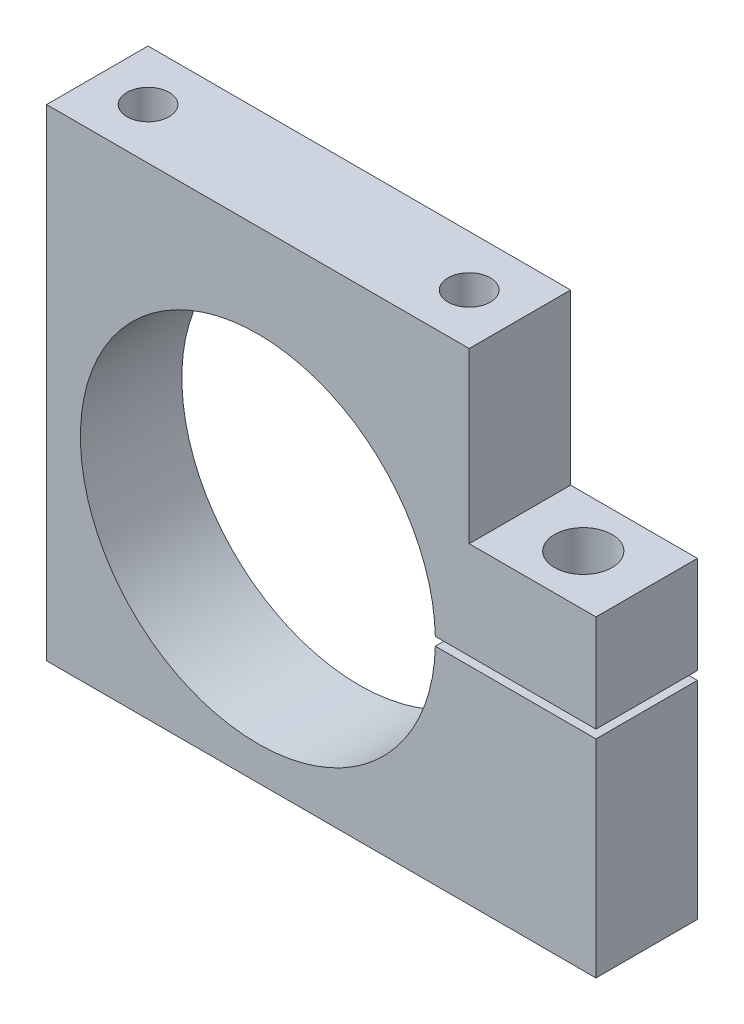
ISO-10303-21;
HEADER;
FILE_DESCRIPTION(('STEP AP214'),'2;1');
FILE_NAME('part.step','',(''),(''),'','','');
FILE_SCHEMA(('AUTOMOTIVE_DESIGN { 1 0 10303 214 1 1 1 1 }'));
ENDSEC;
DATA;
#1=APPLICATION_CONTEXT('core data for automotive mechanical design processes');
#2=APPLICATION_PROTOCOL_DEFINITION('international standard','automotive_design',2000,#1);
#3=PRODUCT_CONTEXT('',#1,'mechanical');
#4=PRODUCT('Part','Part','',(#3));
#5=PRODUCT_RELATED_PRODUCT_CATEGORY('part','',(#4));
#6=PRODUCT_DEFINITION_FORMATION('','',#4);
#7=PRODUCT_DEFINITION_CONTEXT('part definition',#1,'design');
#8=PRODUCT_DEFINITION('design','',#6,#7);
#9=PRODUCT_DEFINITION_SHAPE('','',#8);
#10=(LENGTH_UNIT() NAMED_UNIT(*) SI_UNIT(.MILLI.,.METRE.));
#11=(NAMED_UNIT(*) PLANE_ANGLE_UNIT() SI_UNIT($,.RADIAN.));
#12=(NAMED_UNIT(*) SI_UNIT($,.STERADIAN.) SOLID_ANGLE_UNIT());
#13=UNCERTAINTY_MEASURE_WITH_UNIT(LENGTH_MEASURE(1.E-05),#10,'distance_accuracy_value','');
#14=(GEOMETRIC_REPRESENTATION_CONTEXT(3) GLOBAL_UNCERTAINTY_ASSIGNED_CONTEXT((#13)) GLOBAL_UNIT_ASSIGNED_CONTEXT((#10,
#11,#12)) REPRESENTATION_CONTEXT('',''));
#15=CARTESIAN_POINT('',(0.,0.,0.));
#16=DIRECTION('',(0.,0.,1.));
#17=DIRECTION('',(1.,0.,0.));
#18=AXIS2_PLACEMENT_3D('',#15,#16,#17);
#19=CARTESIAN_POINT('',(65.,37.,12.));
#20=DIRECTION('',(-1.,0.,0.));
#21=DIRECTION('',(0.,0.,1.));
#22=AXIS2_PLACEMENT_3D('',#19,#20,#21);
#23=PLANE('',#22);
#24=DIRECTION('',(0.,1.,0.));
#25=VECTOR('',#24,1.);
#26=CARTESIAN_POINT('',(65.,37.,12.));
#27=LINE('',#26,#25);
#28=CARTESIAN_POINT('',(65.,25.5,12.));
#29=VERTEX_POINT('',#28);
#30=CARTESIAN_POINT('',(65.,37.,12.));
#31=VERTEX_POINT('',#30);
#32=EDGE_CURVE('E195',#29,#31,#27,.T.);
#33=ORIENTED_EDGE('',*,*,#32,.F.);
#34=DIRECTION('',(0.,0.,1.));
#35=VECTOR('',#34,1.);
#36=CARTESIAN_POINT('',(65.,25.5,0.));
#37=LINE('',#36,#35);
#38=CARTESIAN_POINT('',(65.,25.5,0.));
#39=VERTEX_POINT('',#38);
#40=EDGE_CURVE('E181',#39,#29,#37,.T.);
#41=ORIENTED_EDGE('',*,*,#40,.F.);
#42=DIRECTION('',(0.,1.,0.));
#43=VECTOR('',#42,1.);
#44=CARTESIAN_POINT('',(65.,37.,0.));
#45=LINE('',#44,#43);
#46=CARTESIAN_POINT('',(65.,37.,0.));
#47=VERTEX_POINT('',#46);
#48=EDGE_CURVE('E211',#39,#47,#45,.T.);
#49=ORIENTED_EDGE('',*,*,#48,.T.);
#50=DIRECTION('',(0.,0.,-1.));
#51=VECTOR('',#50,1.);
#52=CARTESIAN_POINT('',(65.,37.,12.));
#53=LINE('',#52,#51);
#54=EDGE_CURVE('E233',#31,#47,#53,.T.);
#55=ORIENTED_EDGE('',*,*,#54,.F.);
#56=EDGE_LOOP('',(#33,#41,#49,#55));
#57=FACE_BOUND('',#56,.T.);
#58=ADVANCED_FACE('F41',(#57),#23,.F.);
#59=CARTESIAN_POINT('',(0.,0.,12.));
#60=DIRECTION('',(0.,0.,-1.));
#61=DIRECTION('',(-1.,0.,0.));
#62=AXIS2_PLACEMENT_3D('',#59,#60,#61);
#63=PLANE('',#62);
#64=CARTESIAN_POINT('',(25.,25.,12.));
#65=DIRECTION('',(0.,0.,1.));
#66=DIRECTION('',(1.,0.,0.));
#67=AXIS2_PLACEMENT_3D('',#64,#65,#66);
#68=CIRCLE('',#67,21.);
#69=CARTESIAN_POINT('',(45.994046775217,25.5,12.));
#70=VERTEX_POINT('',#69);
#71=CARTESIAN_POINT('',(45.994046775217,24.5,12.));
#72=VERTEX_POINT('',#71);
#73=EDGE_CURVE('E186',#70,#72,#68,.T.);
#74=ORIENTED_EDGE('',*,*,#73,.F.);
#75=DIRECTION('',(-1.,0.,0.));
#76=VECTOR('',#75,1.);
#77=CARTESIAN_POINT('',(45.,25.5,12.));
#78=LINE('',#77,#76);
#79=EDGE_CURVE('E64',#29,#70,#78,.T.);
#80=ORIENTED_EDGE('',*,*,#79,.F.);
#81=ORIENTED_EDGE('',*,*,#32,.T.);
#82=DIRECTION('',(-1.,0.,0.));
#83=VECTOR('',#82,1.);
#84=CARTESIAN_POINT('',(50.,37.,12.));
#85=LINE('',#84,#83);
#86=CARTESIAN_POINT('',(50.,37.,12.));
#87=VERTEX_POINT('',#86);
#88=EDGE_CURVE('E200',#31,#87,#85,.T.);
#89=ORIENTED_EDGE('',*,*,#88,.T.);
#90=DIRECTION('',(0.,1.,0.));
#91=VECTOR('',#90,1.);
#92=CARTESIAN_POINT('',(50.,57.,12.));
#93=LINE('',#92,#91);
#94=CARTESIAN_POINT('',(50.,57.,12.));
#95=VERTEX_POINT('',#94);
#96=EDGE_CURVE('E202',#87,#95,#93,.T.);
#97=ORIENTED_EDGE('',*,*,#96,.T.);
#98=DIRECTION('',(-1.,0.,0.));
#99=VECTOR('',#98,1.);
#100=CARTESIAN_POINT('',(0.,57.,12.));
#101=LINE('',#100,#99);
#102=CARTESIAN_POINT('',(0.,57.,12.));
#103=VERTEX_POINT('',#102);
#104=EDGE_CURVE('E204',#95,#103,#101,.T.);
#105=ORIENTED_EDGE('',*,*,#104,.T.);
#106=DIRECTION('',(0.,-1.,0.));
#107=VECTOR('',#106,1.);
#108=CARTESIAN_POINT('',(0.,0.,12.));
#109=LINE('',#108,#107);
#110=CARTESIAN_POINT('',(0.,0.,12.));
#111=VERTEX_POINT('',#110);
#112=EDGE_CURVE('E206',#103,#111,#109,.T.);
#113=ORIENTED_EDGE('',*,*,#112,.T.);
#114=DIRECTION('',(1.,0.,0.));
#115=VECTOR('',#114,1.);
#116=CARTESIAN_POINT('',(0.,0.,12.));
#117=LINE('',#116,#115);
#118=CARTESIAN_POINT('',(65.,0.,12.));
#119=VERTEX_POINT('',#118);
#120=EDGE_CURVE('E192',#111,#119,#117,.T.);
#121=ORIENTED_EDGE('',*,*,#120,.T.);
#122=CARTESIAN_POINT('',(65.,24.5,12.));
#123=VERTEX_POINT('',#122);
#124=EDGE_CURVE('E197',#119,#123,#27,.T.);
#125=ORIENTED_EDGE('',*,*,#124,.T.);
#126=DIRECTION('',(1.,0.,0.));
#127=VECTOR('',#126,1.);
#128=CARTESIAN_POINT('',(65.,24.5,12.));
#129=LINE('',#128,#127);
#130=EDGE_CURVE('E173',#72,#123,#129,.T.);
#131=ORIENTED_EDGE('',*,*,#130,.F.);
#132=EDGE_LOOP('',(#74,#80,#81,#89,#97,#105,#113,#121,#125,#131));
#133=FACE_BOUND('',#132,.T.);
#134=ADVANCED_FACE('F245',(#133),#63,.F.);
#135=CARTESIAN_POINT('',(0.,0.,0.));
#136=DIRECTION('',(0.,0.,-1.));
#137=DIRECTION('',(-1.,0.,0.));
#138=AXIS2_PLACEMENT_3D('',#135,#136,#137);
#139=PLANE('',#138);
#140=DIRECTION('',(-1.,0.,0.));
#141=VECTOR('',#140,1.);
#142=CARTESIAN_POINT('',(45.,25.5,0.));
#143=LINE('',#142,#141);
#144=CARTESIAN_POINT('',(45.994046775217,25.5,0.));
#145=VERTEX_POINT('',#144);
#146=EDGE_CURVE('E175',#39,#145,#143,.T.);
#147=ORIENTED_EDGE('',*,*,#146,.T.);
#148=CARTESIAN_POINT('',(25.,25.,0.));
#149=DIRECTION('',(0.,0.,1.));
#150=DIRECTION('',(1.,0.,0.));
#151=AXIS2_PLACEMENT_3D('',#148,#149,#150);
#152=CIRCLE('',#151,21.);
#153=CARTESIAN_POINT('',(45.994046775217,24.5,0.));
#154=VERTEX_POINT('',#153);
#155=EDGE_CURVE('E183',#145,#154,#152,.T.);
#156=ORIENTED_EDGE('',*,*,#155,.T.);
#157=DIRECTION('',(1.,0.,0.));
#158=VECTOR('',#157,1.);
#159=CARTESIAN_POINT('',(65.,24.5,0.));
#160=LINE('',#159,#158);
#161=CARTESIAN_POINT('',(65.,24.5,0.));
#162=VERTEX_POINT('',#161);
#163=EDGE_CURVE('E57',#154,#162,#160,.T.);
#164=ORIENTED_EDGE('',*,*,#163,.T.);
#165=CARTESIAN_POINT('',(65.,0.,0.));
#166=VERTEX_POINT('',#165);
#167=EDGE_CURVE('E212',#166,#162,#45,.T.);
#168=ORIENTED_EDGE('',*,*,#167,.F.);
#169=DIRECTION('',(1.,0.,0.));
#170=VECTOR('',#169,1.);
#171=CARTESIAN_POINT('',(0.,0.,0.));
#172=LINE('',#171,#170);
#173=CARTESIAN_POINT('',(0.,0.,0.));
#174=VERTEX_POINT('',#173);
#175=EDGE_CURVE('E189',#174,#166,#172,.T.);
#176=ORIENTED_EDGE('',*,*,#175,.F.);
#177=DIRECTION('',(0.,-1.,0.));
#178=VECTOR('',#177,1.);
#179=CARTESIAN_POINT('',(0.,0.,0.));
#180=LINE('',#179,#178);
#181=CARTESIAN_POINT('',(0.,57.,0.));
#182=VERTEX_POINT('',#181);
#183=EDGE_CURVE('E196',#182,#174,#180,.T.);
#184=ORIENTED_EDGE('',*,*,#183,.F.);
#185=DIRECTION('',(-1.,0.,0.));
#186=VECTOR('',#185,1.);
#187=CARTESIAN_POINT('',(0.,57.,0.));
#188=LINE('',#187,#186);
#189=CARTESIAN_POINT('',(50.,57.,0.));
#190=VERTEX_POINT('',#189);
#191=EDGE_CURVE('E219',#190,#182,#188,.T.);
#192=ORIENTED_EDGE('',*,*,#191,.F.);
#193=DIRECTION('',(0.,1.,0.));
#194=VECTOR('',#193,1.);
#195=CARTESIAN_POINT('',(50.,57.,0.));
#196=LINE('',#195,#194);
#197=CARTESIAN_POINT('',(50.,37.,0.));
#198=VERTEX_POINT('',#197);
#199=EDGE_CURVE('E217',#198,#190,#196,.T.);
#200=ORIENTED_EDGE('',*,*,#199,.F.);
#201=DIRECTION('',(-1.,0.,0.));
#202=VECTOR('',#201,1.);
#203=CARTESIAN_POINT('',(50.,37.,0.));
#204=LINE('',#203,#202);
#205=EDGE_CURVE('E215',#47,#198,#204,.T.);
#206=ORIENTED_EDGE('',*,*,#205,.F.);
#207=ORIENTED_EDGE('',*,*,#48,.F.);
#208=EDGE_LOOP('',(#147,#156,#164,#168,#176,#184,#192,#200,#206,#207));
#209=FACE_BOUND('',#208,.T.);
#210=ADVANCED_FACE('F251',(#209),#139,.T.);
#211=CARTESIAN_POINT('',(0.,0.,12.));
#212=DIRECTION('',(0.,1.,0.));
#213=DIRECTION('',(0.,0.,1.));
#214=AXIS2_PLACEMENT_3D('',#211,#212,#213);
#215=PLANE('',#214);
#216=CARTESIAN_POINT('',(4.,0.,6.));
#217=DIRECTION('',(0.,-1.,0.));
#218=DIRECTION('',(0.,0.,-1.));
#219=AXIS2_PLACEMENT_3D('',#216,#217,#218);
#220=CIRCLE('',#219,2.49999999999999);
#221=CARTESIAN_POINT('',(4.,0.,3.50000000000001));
#222=VERTEX_POINT('',#221);
#223=EDGE_CURVE('E142',#222,#222,#220,.T.);
#224=ORIENTED_EDGE('',*,*,#223,.F.);
#225=EDGE_LOOP('',(#224));
#226=FACE_BOUND('',#225,.T.);
#227=CARTESIAN_POINT('',(48.,0.,6.));
#228=DIRECTION('',(0.,-1.,0.));
#229=DIRECTION('',(0.,0.,-1.));
#230=AXIS2_PLACEMENT_3D('',#227,#228,#229);
#231=CIRCLE('',#230,2.49999999999999);
#232=CARTESIAN_POINT('',(48.,0.,3.50000000000001));
#233=VERTEX_POINT('',#232);
#234=EDGE_CURVE('E141',#233,#233,#231,.T.);
#235=ORIENTED_EDGE('',*,*,#234,.F.);
#236=EDGE_LOOP('',(#235));
#237=FACE_BOUND('',#236,.T.);
#238=ORIENTED_EDGE('',*,*,#175,.T.);
#239=DIRECTION('',(0.,0.,-1.));
#240=VECTOR('',#239,1.);
#241=CARTESIAN_POINT('',(65.,0.,12.));
#242=LINE('',#241,#240);
#243=EDGE_CURVE('E236',#119,#166,#242,.T.);
#244=ORIENTED_EDGE('',*,*,#243,.F.);
#245=ORIENTED_EDGE('',*,*,#120,.F.);
#246=DIRECTION('',(0.,0.,-1.));
#247=VECTOR('',#246,1.);
#248=CARTESIAN_POINT('',(0.,0.,12.));
#249=LINE('',#248,#247);
#250=EDGE_CURVE('E208',#111,#174,#249,.T.);
#251=ORIENTED_EDGE('',*,*,#250,.T.);
#252=EDGE_LOOP('',(#238,#244,#245,#251));
#253=FACE_BOUND('',#252,.T.);
#254=ADVANCED_FACE('F43',(#226,#237,#253),#215,.F.);
#255=ORIENTED_EDGE('',*,*,#167,.T.);
#256=DIRECTION('',(0.,0.,1.));
#257=VECTOR('',#256,1.);
#258=CARTESIAN_POINT('',(65.,24.5,0.));
#259=LINE('',#258,#257);
#260=EDGE_CURVE('E178',#162,#123,#259,.T.);
#261=ORIENTED_EDGE('',*,*,#260,.T.);
#262=ORIENTED_EDGE('',*,*,#124,.F.);
#263=ORIENTED_EDGE('',*,*,#243,.T.);
#264=EDGE_LOOP('',(#255,#261,#262,#263));
#265=FACE_BOUND('',#264,.T.);
#266=ADVANCED_FACE('F280',(#265),#23,.F.);
#267=CARTESIAN_POINT('',(50.,37.,12.));
#268=DIRECTION('',(0.,-1.,0.));
#269=DIRECTION('',(0.,0.,-1.));
#270=AXIS2_PLACEMENT_3D('',#267,#268,#269);
#271=PLANE('',#270);
#272=CARTESIAN_POINT('',(57.5,37.,6.));
#273=DIRECTION('',(0.,1.,0.));
#274=DIRECTION('',(0.,0.,1.));
#275=AXIS2_PLACEMENT_3D('',#272,#273,#274);
#276=CIRCLE('',#275,3.4);
#277=CARTESIAN_POINT('',(57.5,37.,9.4));
#278=VERTEX_POINT('',#277);
#279=EDGE_CURVE('E164',#278,#278,#276,.T.);
#280=ORIENTED_EDGE('',*,*,#279,.F.);
#281=EDGE_LOOP('',(#280));
#282=FACE_BOUND('',#281,.T.);
#283=ORIENTED_EDGE('',*,*,#205,.T.);
#284=DIRECTION('',(0.,0.,-1.));
#285=VECTOR('',#284,1.);
#286=CARTESIAN_POINT('',(50.,37.,12.));
#287=LINE('',#286,#285);
#288=EDGE_CURVE('E230',#87,#198,#287,.T.);
#289=ORIENTED_EDGE('',*,*,#288,.F.);
#290=ORIENTED_EDGE('',*,*,#88,.F.);
#291=ORIENTED_EDGE('',*,*,#54,.T.);
#292=EDGE_LOOP('',(#283,#289,#290,#291));
#293=FACE_BOUND('',#292,.T.);
#294=ADVANCED_FACE('F259',(#282,#293),#271,.F.);
#295=CARTESIAN_POINT('',(50.,57.,12.));
#296=DIRECTION('',(-1.,0.,0.));
#297=DIRECTION('',(0.,-1.,0.));
#298=AXIS2_PLACEMENT_3D('',#295,#296,#297);
#299=PLANE('',#298);
#300=ORIENTED_EDGE('',*,*,#199,.T.);
#301=DIRECTION('',(0.,0.,-1.));
#302=VECTOR('',#301,1.);
#303=CARTESIAN_POINT('',(50.,57.,12.));
#304=LINE('',#303,#302);
#305=EDGE_CURVE('E227',#95,#190,#304,.T.);
#306=ORIENTED_EDGE('',*,*,#305,.F.);
#307=ORIENTED_EDGE('',*,*,#96,.F.);
#308=ORIENTED_EDGE('',*,*,#288,.T.);
#309=EDGE_LOOP('',(#300,#306,#307,#308));
#310=FACE_BOUND('',#309,.T.);
#311=ADVANCED_FACE('F266',(#310),#299,.F.);
#312=CARTESIAN_POINT('',(0.,57.,12.));
#313=DIRECTION('',(0.,-1.,0.));
#314=DIRECTION('',(0.,0.,-1.));
#315=AXIS2_PLACEMENT_3D('',#312,#313,#314);
#316=PLANE('',#315);
#317=CARTESIAN_POINT('',(6.,57.,6.));
#318=DIRECTION('',(0.,1.,0.));
#319=DIRECTION('',(0.,0.,1.));
#320=AXIS2_PLACEMENT_3D('',#317,#318,#319);
#321=CIRCLE('',#320,2.5);
#322=CARTESIAN_POINT('',(6.,57.,8.5));
#323=VERTEX_POINT('',#322);
#324=EDGE_CURVE('E152',#323,#323,#321,.T.);
#325=ORIENTED_EDGE('',*,*,#324,.F.);
#326=EDGE_LOOP('',(#325));
#327=FACE_BOUND('',#326,.T.);
#328=CARTESIAN_POINT('',(44.,57.,6.));
#329=DIRECTION('',(0.,1.,0.));
#330=DIRECTION('',(0.,0.,1.));
#331=AXIS2_PLACEMENT_3D('',#328,#329,#330);
#332=CIRCLE('',#331,2.5);
#333=CARTESIAN_POINT('',(44.,57.,8.49999999999999));
#334=VERTEX_POINT('',#333);
#335=EDGE_CURVE('E158',#334,#334,#332,.T.);
#336=ORIENTED_EDGE('',*,*,#335,.F.);
#337=EDGE_LOOP('',(#336));
#338=FACE_BOUND('',#337,.T.);
#339=ORIENTED_EDGE('',*,*,#191,.T.);
#340=DIRECTION('',(0.,0.,-1.));
#341=VECTOR('',#340,1.);
#342=CARTESIAN_POINT('',(0.,57.,12.));
#343=LINE('',#342,#341);
#344=EDGE_CURVE('E224',#103,#182,#343,.T.);
#345=ORIENTED_EDGE('',*,*,#344,.F.);
#346=ORIENTED_EDGE('',*,*,#104,.F.);
#347=ORIENTED_EDGE('',*,*,#305,.T.);
#348=EDGE_LOOP('',(#339,#345,#346,#347));
#349=FACE_BOUND('',#348,.T.);
#350=ADVANCED_FACE('F269',(#327,#338,#349),#316,.F.);
#351=CARTESIAN_POINT('',(0.,0.,12.));
#352=DIRECTION('',(1.,0.,0.));
#353=DIRECTION('',(0.,0.,-1.));
#354=AXIS2_PLACEMENT_3D('',#351,#352,#353);
#355=PLANE('',#354);
#356=ORIENTED_EDGE('',*,*,#183,.T.);
#357=ORIENTED_EDGE('',*,*,#250,.F.);
#358=ORIENTED_EDGE('',*,*,#112,.F.);
#359=ORIENTED_EDGE('',*,*,#344,.T.);
#360=EDGE_LOOP('',(#356,#357,#358,#359));
#361=FACE_BOUND('',#360,.T.);
#362=ADVANCED_FACE('F274',(#361),#355,.F.);
#363=CARTESIAN_POINT('',(25.,25.,12.));
#364=DIRECTION('',(0.,0.,-1.));
#365=DIRECTION('',(-1.,0.,0.));
#366=AXIS2_PLACEMENT_3D('',#363,#364,#365);
#367=CYLINDRICAL_SURFACE('',#366,21.);
#368=DIRECTION('',(0.,0.,-1.));
#369=VECTOR('',#368,1.);
#370=CARTESIAN_POINT('',(45.994046775217,25.5,12.));
#371=LINE('',#370,#369);
#372=EDGE_CURVE('E11',#70,#145,#371,.T.);
#373=ORIENTED_EDGE('',*,*,#372,.F.);
#374=ORIENTED_EDGE('',*,*,#73,.T.);
#375=DIRECTION('',(0.,0.,-1.));
#376=VECTOR('',#375,1.);
#377=CARTESIAN_POINT('',(45.994046775217,24.5,12.));
#378=LINE('',#377,#376);
#379=EDGE_CURVE('E50',#154,#72,#378,.F.);
#380=ORIENTED_EDGE('',*,*,#379,.F.);
#381=ORIENTED_EDGE('',*,*,#155,.F.);
#382=EDGE_LOOP('',(#373,#374,#380,#381));
#383=FACE_BOUND('',#382,.T.);
#384=ADVANCED_FACE('F246',(#383),#367,.F.);
#385=CARTESIAN_POINT('',(65.,24.5,0.));
#386=DIRECTION('',(0.,-1.,0.));
#387=DIRECTION('',(1.,0.,0.));
#388=AXIS2_PLACEMENT_3D('',#385,#386,#387);
#389=PLANE('',#388);
#390=CARTESIAN_POINT('',(57.5,24.5,6.));
#391=DIRECTION('',(0.,-1.,0.));
#392=DIRECTION('',(1.,0.,0.));
#393=AXIS2_PLACEMENT_3D('',#390,#391,#392);
#394=CIRCLE('',#393,3.4);
#395=CARTESIAN_POINT('',(60.9,24.5,6.));
#396=VERTEX_POINT('',#395);
#397=EDGE_CURVE('E170',#396,#396,#394,.T.);
#398=ORIENTED_EDGE('',*,*,#397,.T.);
#399=EDGE_LOOP('',(#398));
#400=FACE_BOUND('',#399,.T.);
#401=ORIENTED_EDGE('',*,*,#379,.T.);
#402=ORIENTED_EDGE('',*,*,#130,.T.);
#403=ORIENTED_EDGE('',*,*,#260,.F.);
#404=ORIENTED_EDGE('',*,*,#163,.F.);
#405=EDGE_LOOP('',(#401,#402,#403,#404));
#406=FACE_BOUND('',#405,.T.);
#407=ADVANCED_FACE('F240',(#400,#406),#389,.F.);
#408=CARTESIAN_POINT('',(45.,25.5,0.));
#409=DIRECTION('',(0.,1.,0.));
#410=DIRECTION('',(0.,0.,1.));
#411=AXIS2_PLACEMENT_3D('',#408,#409,#410);
#412=PLANE('',#411);
#413=CARTESIAN_POINT('',(57.5,25.5,6.));
#414=DIRECTION('',(0.,1.,0.));
#415=DIRECTION('',(0.,0.,1.));
#416=AXIS2_PLACEMENT_3D('',#413,#414,#415);
#417=CIRCLE('',#416,3.4);
#418=CARTESIAN_POINT('',(57.5,25.5,9.4));
#419=VERTEX_POINT('',#418);
#420=EDGE_CURVE('E45',#419,#419,#417,.T.);
#421=ORIENTED_EDGE('',*,*,#420,.T.);
#422=EDGE_LOOP('',(#421));
#423=FACE_BOUND('',#422,.T.);
#424=ORIENTED_EDGE('',*,*,#372,.T.);
#425=ORIENTED_EDGE('',*,*,#146,.F.);
#426=ORIENTED_EDGE('',*,*,#40,.T.);
#427=ORIENTED_EDGE('',*,*,#79,.T.);
#428=EDGE_LOOP('',(#424,#425,#426,#427));
#429=FACE_BOUND('',#428,.T.);
#430=ADVANCED_FACE('F247',(#423,#429),#412,.F.);
#431=CARTESIAN_POINT('',(57.5,37.,6.));
#432=DIRECTION('',(0.,1.,0.));
#433=DIRECTION('',(0.,0.,1.));
#434=AXIS2_PLACEMENT_3D('',#431,#432,#433);
#435=CYLINDRICAL_SURFACE('',#434,3.4);
#436=ORIENTED_EDGE('',*,*,#279,.T.);
#437=EDGE_LOOP('',(#436));
#438=FACE_BOUND('',#437,.T.);
#439=ORIENTED_EDGE('',*,*,#420,.F.);
#440=EDGE_LOOP('',(#439));
#441=FACE_BOUND('',#440,.T.);
#442=ADVANCED_FACE('F338',(#438,#441),#435,.F.);
#443=CARTESIAN_POINT('',(57.5,12.,6.));
#444=DIRECTION('',(0.,1.,0.));
#445=DIRECTION('',(0.,0.,1.));
#446=AXIS2_PLACEMENT_3D('',#443,#444,#445);
#447=CIRCLE('',#446,3.39999999999999);
#448=CARTESIAN_POINT('',(57.5,12.,9.39999999999999));
#449=VERTEX_POINT('',#448);
#450=EDGE_CURVE('E167',#449,#449,#447,.T.);
#451=ORIENTED_EDGE('',*,*,#450,.F.);
#452=EDGE_LOOP('',(#451));
#453=FACE_BOUND('',#452,.T.);
#454=ORIENTED_EDGE('',*,*,#397,.F.);
#455=EDGE_LOOP('',(#454));
#456=FACE_BOUND('',#455,.T.);
#457=ADVANCED_FACE('F346',(#453,#456),#435,.F.);
#458=CARTESIAN_POINT('',(57.5,12.,6.));
#459=DIRECTION('',(0.,1.,0.));
#460=DIRECTION('',(0.,0.,1.));
#461=AXIS2_PLACEMENT_3D('',#458,#459,#460);
#462=CONICAL_SURFACE('',#461,3.39999999999999,1.02974425867665);
#463=CARTESIAN_POINT('',(57.5,9.9570738953063,6.));
#464=VERTEX_POINT('',#463);
#465=VERTEX_LOOP('',#464);
#466=FACE_BOUND('',#465,.T.);
#467=ORIENTED_EDGE('',*,*,#450,.T.);
#468=EDGE_LOOP('',(#467));
#469=FACE_BOUND('',#468,.T.);
#470=ADVANCED_FACE('F354',(#466,#469),#462,.F.);
#471=CARTESIAN_POINT('',(44.,42.,6.));
#472=DIRECTION('',(0.,1.,0.));
#473=DIRECTION('',(0.,0.,1.));
#474=AXIS2_PLACEMENT_3D('',#471,#472,#473);
#475=CONICAL_SURFACE('',#474,2.5,1.02974425867665);
#476=CARTESIAN_POINT('',(44.,40.4978484524311,6.));
#477=VERTEX_POINT('',#476);
#478=VERTEX_LOOP('',#477);
#479=FACE_BOUND('',#478,.T.);
#480=CARTESIAN_POINT('',(44.,42.,6.));
#481=DIRECTION('',(0.,1.,0.));
#482=DIRECTION('',(0.,0.,1.));
#483=AXIS2_PLACEMENT_3D('',#480,#481,#482);
#484=CIRCLE('',#483,2.5);
#485=CARTESIAN_POINT('',(44.,42.,8.49999999999999));
#486=VERTEX_POINT('',#485);
#487=EDGE_CURVE('E161',#486,#486,#484,.T.);
#488=ORIENTED_EDGE('',*,*,#487,.T.);
#489=EDGE_LOOP('',(#488));
#490=FACE_BOUND('',#489,.T.);
#491=ADVANCED_FACE('F360',(#479,#490),#475,.F.);
#492=CARTESIAN_POINT('',(44.,57.,6.));
#493=DIRECTION('',(0.,1.,0.));
#494=DIRECTION('',(0.,0.,1.));
#495=AXIS2_PLACEMENT_3D('',#492,#493,#494);
#496=CYLINDRICAL_SURFACE('',#495,2.5);
#497=ORIENTED_EDGE('',*,*,#487,.F.);
#498=EDGE_LOOP('',(#497));
#499=FACE_BOUND('',#498,.T.);
#500=ORIENTED_EDGE('',*,*,#335,.T.);
#501=EDGE_LOOP('',(#500));
#502=FACE_BOUND('',#501,.T.);
#503=ADVANCED_FACE('F367',(#499,#502),#496,.F.);
#504=CARTESIAN_POINT('',(6.,42.,6.));
#505=DIRECTION('',(0.,1.,0.));
#506=DIRECTION('',(0.,0.,1.));
#507=AXIS2_PLACEMENT_3D('',#504,#505,#506);
#508=CONICAL_SURFACE('',#507,2.5,1.02974425867665);
#509=CARTESIAN_POINT('',(6.,40.4978484524311,6.));
#510=VERTEX_POINT('',#509);
#511=VERTEX_LOOP('',#510);
#512=FACE_BOUND('',#511,.T.);
#513=CARTESIAN_POINT('',(6.,42.,6.));
#514=DIRECTION('',(0.,1.,0.));
#515=DIRECTION('',(0.,0.,1.));
#516=AXIS2_PLACEMENT_3D('',#513,#514,#515);
#517=CIRCLE('',#516,2.5);
#518=CARTESIAN_POINT('',(6.,42.,8.49999999999999));
#519=VERTEX_POINT('',#518);
#520=EDGE_CURVE('E155',#519,#519,#517,.T.);
#521=ORIENTED_EDGE('',*,*,#520,.T.);
#522=EDGE_LOOP('',(#521));
#523=FACE_BOUND('',#522,.T.);
#524=ADVANCED_FACE('F375',(#512,#523),#508,.F.);
#525=CARTESIAN_POINT('',(6.,57.,6.));
#526=DIRECTION('',(0.,1.,0.));
#527=DIRECTION('',(0.,0.,1.));
#528=AXIS2_PLACEMENT_3D('',#525,#526,#527);
#529=CYLINDRICAL_SURFACE('',#528,2.5);
#530=ORIENTED_EDGE('',*,*,#520,.F.);
#531=EDGE_LOOP('',(#530));
#532=FACE_BOUND('',#531,.T.);
#533=ORIENTED_EDGE('',*,*,#324,.T.);
#534=EDGE_LOOP('',(#533));
#535=FACE_BOUND('',#534,.T.);
#536=ADVANCED_FACE('F383',(#532,#535),#529,.F.);
#537=CARTESIAN_POINT('',(48.,15.,6.));
#538=DIRECTION('',(0.,-1.,0.));
#539=DIRECTION('',(0.,0.,-1.));
#540=AXIS2_PLACEMENT_3D('',#537,#538,#539);
#541=CONICAL_SURFACE('',#540,2.49999999999999,1.02974425867665);
#542=CARTESIAN_POINT('',(48.,16.5021515475689,6.));
#543=VERTEX_POINT('',#542);
#544=VERTEX_LOOP('',#543);
#545=FACE_BOUND('',#544,.T.);
#546=CARTESIAN_POINT('',(48.,15.,6.));
#547=DIRECTION('',(0.,-1.,0.));
#548=DIRECTION('',(0.,0.,-1.));
#549=AXIS2_PLACEMENT_3D('',#546,#547,#548);
#550=CIRCLE('',#549,2.49999999999999);
#551=CARTESIAN_POINT('',(48.,15.,3.50000000000001));
#552=VERTEX_POINT('',#551);
#553=EDGE_CURVE('E145',#552,#552,#550,.T.);
#554=ORIENTED_EDGE('',*,*,#553,.T.);
#555=EDGE_LOOP('',(#554));
#556=FACE_BOUND('',#555,.T.);
#557=ADVANCED_FACE('F391',(#545,#556),#541,.F.);
#558=CARTESIAN_POINT('',(48.,0.,6.));
#559=DIRECTION('',(0.,-1.,0.));
#560=DIRECTION('',(0.,0.,-1.));
#561=AXIS2_PLACEMENT_3D('',#558,#559,#560);
#562=CYLINDRICAL_SURFACE('',#561,2.49999999999999);
#563=ORIENTED_EDGE('',*,*,#553,.F.);
#564=EDGE_LOOP('',(#563));
#565=FACE_BOUND('',#564,.T.);
#566=ORIENTED_EDGE('',*,*,#234,.T.);
#567=EDGE_LOOP('',(#566));
#568=FACE_BOUND('',#567,.T.);
#569=ADVANCED_FACE('F135',(#565,#568),#562,.F.);
#570=CARTESIAN_POINT('',(4.,15.,6.));
#571=DIRECTION('',(0.,-1.,0.));
#572=DIRECTION('',(0.,0.,-1.));
#573=AXIS2_PLACEMENT_3D('',#570,#571,#572);
#574=CONICAL_SURFACE('',#573,2.49999999999999,1.02974425867665);
#575=CARTESIAN_POINT('',(4.,16.5021515475689,6.));
#576=VERTEX_POINT('',#575);
#577=VERTEX_LOOP('',#576);
#578=FACE_BOUND('',#577,.T.);
#579=CARTESIAN_POINT('',(4.,15.,6.));
#580=DIRECTION('',(0.,-1.,0.));
#581=DIRECTION('',(0.,0.,-1.));
#582=AXIS2_PLACEMENT_3D('',#579,#580,#581);
#583=CIRCLE('',#582,2.49999999999999);
#584=CARTESIAN_POINT('',(4.,15.,3.50000000000001));
#585=VERTEX_POINT('',#584);
#586=EDGE_CURVE('E139',#585,#585,#583,.T.);
#587=ORIENTED_EDGE('',*,*,#586,.T.);
#588=EDGE_LOOP('',(#587));
#589=FACE_BOUND('',#588,.T.);
#590=ADVANCED_FACE('F131',(#578,#589),#574,.F.);
#591=CARTESIAN_POINT('',(4.,0.,6.));
#592=DIRECTION('',(0.,-1.,0.));
#593=DIRECTION('',(0.,0.,-1.));
#594=AXIS2_PLACEMENT_3D('',#591,#592,#593);
#595=CYLINDRICAL_SURFACE('',#594,2.49999999999999);
#596=ORIENTED_EDGE('',*,*,#586,.F.);
#597=EDGE_LOOP('',(#596));
#598=FACE_BOUND('',#597,.T.);
#599=ORIENTED_EDGE('',*,*,#223,.T.);
#600=EDGE_LOOP('',(#599));
#601=FACE_BOUND('',#600,.T.);
#602=ADVANCED_FACE('F134',(#598,#601),#595,.F.);
#603=CLOSED_SHELL('',(#58,#134,#210,#254,#266,#294,#311,#350,#362,#384,#407,#430,#442,#457,#470,
#491,#503,#524,#536,#557,#569,#590,#602));
#604=MANIFOLD_SOLID_BREP('B2',#603);
#605=ADVANCED_BREP_SHAPE_REPRESENTATION('',(#18,#604),#14);
#606=SHAPE_DEFINITION_REPRESENTATION(#9,#605);
ENDSEC;
END-ISO-10303-21;
